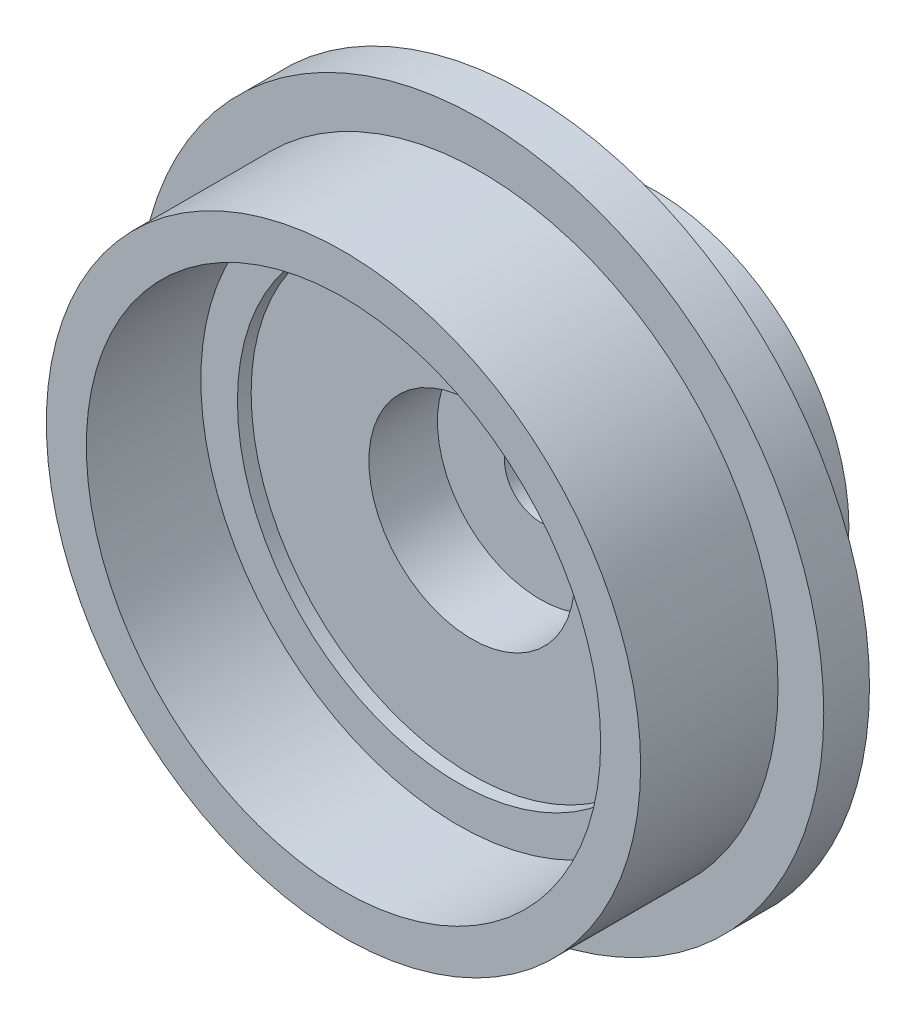
ISO-10303-21;
HEADER;
FILE_DESCRIPTION(('STEP AP214'),'2;1');
FILE_NAME('part.step','',(''),(''),'','','');
FILE_SCHEMA(('AUTOMOTIVE_DESIGN { 1 0 10303 214 1 1 1 1 }'));
ENDSEC;
DATA;
#1=APPLICATION_CONTEXT('core data for automotive mechanical design processes');
#2=APPLICATION_PROTOCOL_DEFINITION('international standard','automotive_design',2000,#1);
#3=PRODUCT_CONTEXT('',#1,'mechanical');
#4=PRODUCT('Part','Part','',(#3));
#5=PRODUCT_RELATED_PRODUCT_CATEGORY('part','',(#4));
#6=PRODUCT_DEFINITION_FORMATION('','',#4);
#7=PRODUCT_DEFINITION_CONTEXT('part definition',#1,'design');
#8=PRODUCT_DEFINITION('design','',#6,#7);
#9=PRODUCT_DEFINITION_SHAPE('','',#8);
#10=(LENGTH_UNIT() NAMED_UNIT(*) SI_UNIT(.MILLI.,.METRE.));
#11=(NAMED_UNIT(*) PLANE_ANGLE_UNIT() SI_UNIT($,.RADIAN.));
#12=(NAMED_UNIT(*) SI_UNIT($,.STERADIAN.) SOLID_ANGLE_UNIT());
#13=UNCERTAINTY_MEASURE_WITH_UNIT(LENGTH_MEASURE(1.E-05),#10,'distance_accuracy_value','');
#14=(GEOMETRIC_REPRESENTATION_CONTEXT(3) GLOBAL_UNCERTAINTY_ASSIGNED_CONTEXT((#13)) GLOBAL_UNIT_ASSIGNED_CONTEXT((#10,
#11,#12)) REPRESENTATION_CONTEXT('',''));
#15=CARTESIAN_POINT('',(0.,0.,0.));
#16=DIRECTION('',(0.,0.,1.));
#17=DIRECTION('',(1.,0.,0.));
#18=AXIS2_PLACEMENT_3D('',#15,#16,#17);
#19=CARTESIAN_POINT('',(0.,0.,-17.2847));
#20=DIRECTION('',(0.,0.,1.));
#21=DIRECTION('',(1.,0.,0.));
#22=AXIS2_PLACEMENT_3D('',#19,#20,#21);
#23=CYLINDRICAL_SURFACE('',#22,1.9939);
#24=CARTESIAN_POINT('',(0.,0.,-17.2847));
#25=DIRECTION('',(0.,0.,1.));
#26=DIRECTION('',(1.,0.,0.));
#27=AXIS2_PLACEMENT_3D('',#24,#25,#26);
#28=CIRCLE('',#27,1.9939);
#29=CARTESIAN_POINT('',(1.9939,0.,-17.2847));
#30=VERTEX_POINT('',#29);
#31=EDGE_CURVE('E73',#30,#30,#28,.T.);
#32=ORIENTED_EDGE('',*,*,#31,.F.);
#33=EDGE_LOOP('',(#32));
#34=FACE_BOUND('',#33,.T.);
#35=CARTESIAN_POINT('',(0.,0.,-10.9347));
#36=DIRECTION('',(0.,0.,1.));
#37=DIRECTION('',(1.,0.,0.));
#38=AXIS2_PLACEMENT_3D('',#35,#36,#37);
#39=CIRCLE('',#38,1.9939);
#40=CARTESIAN_POINT('',(1.9939,0.,-10.9347));
#41=VERTEX_POINT('',#40);
#42=EDGE_CURVE('E39',#41,#41,#39,.F.);
#43=ORIENTED_EDGE('',*,*,#42,.F.);
#44=EDGE_LOOP('',(#43));
#45=FACE_BOUND('',#44,.T.);
#46=ADVANCED_FACE('F35',(#34,#45),#23,.F.);
#47=CARTESIAN_POINT('',(0.,16.51,-7.6327));
#48=DIRECTION('',(0.,0.,-1.));
#49=DIRECTION('',(-1.,0.,0.));
#50=AXIS2_PLACEMENT_3D('',#47,#48,#49);
#51=PLANE('',#50);
#52=CARTESIAN_POINT('',(0.,0.,-7.6327));
#53=DIRECTION('',(0.,0.,1.));
#54=DIRECTION('',(1.,0.,0.));
#55=AXIS2_PLACEMENT_3D('',#52,#53,#54);
#56=CIRCLE('',#55,16.51);
#57=CARTESIAN_POINT('',(16.51,0.,-7.6327));
#58=VERTEX_POINT('',#57);
#59=EDGE_CURVE('E70',#58,#58,#56,.T.);
#60=ORIENTED_EDGE('',*,*,#59,.F.);
#61=EDGE_LOOP('',(#60));
#62=FACE_BOUND('',#61,.T.);
#63=CARTESIAN_POINT('',(0.,0.,-7.6327));
#64=DIRECTION('',(0.,0.,1.));
#65=DIRECTION('',(1.,0.,0.));
#66=AXIS2_PLACEMENT_3D('',#63,#64,#65);
#67=CIRCLE('',#66,19.05);
#68=CARTESIAN_POINT('',(19.05,0.,-7.6327));
#69=VERTEX_POINT('',#68);
#70=EDGE_CURVE('E10',#69,#69,#67,.T.);
#71=ORIENTED_EDGE('',*,*,#70,.T.);
#72=EDGE_LOOP('',(#71));
#73=FACE_BOUND('',#72,.T.);
#74=ADVANCED_FACE('F37',(#62,#73),#51,.F.);
#75=CARTESIAN_POINT('',(0.,0.,32.3517370738342));
#76=DIRECTION('',(0.,0.,1.));
#77=DIRECTION('',(1.,0.,0.));
#78=AXIS2_PLACEMENT_3D('',#75,#76,#77);
#79=CYLINDRICAL_SURFACE('',#78,19.05);
#80=ORIENTED_EDGE('',*,*,#70,.F.);
#81=EDGE_LOOP('',(#80));
#82=FACE_BOUND('',#81,.T.);
#83=CARTESIAN_POINT('',(0.,0.,-10.1727));
#84=DIRECTION('',(0.,0.,1.));
#85=DIRECTION('',(1.,0.,0.));
#86=AXIS2_PLACEMENT_3D('',#83,#84,#85);
#87=CIRCLE('',#86,19.05);
#88=CARTESIAN_POINT('',(19.05,0.,-10.1727));
#89=VERTEX_POINT('',#88);
#90=EDGE_CURVE('E43',#89,#89,#87,.T.);
#91=ORIENTED_EDGE('',*,*,#90,.T.);
#92=EDGE_LOOP('',(#91));
#93=FACE_BOUND('',#92,.T.);
#94=ADVANCED_FACE('F94',(#82,#93),#79,.T.);
#95=CARTESIAN_POINT('',(0.,19.05,-10.1727));
#96=DIRECTION('',(0.,0.,1.));
#97=DIRECTION('',(1.,0.,0.));
#98=AXIS2_PLACEMENT_3D('',#95,#96,#97);
#99=PLANE('',#98);
#100=ORIENTED_EDGE('',*,*,#90,.F.);
#101=EDGE_LOOP('',(#100));
#102=FACE_BOUND('',#101,.T.);
#103=CARTESIAN_POINT('',(0.,0.,-10.1727));
#104=DIRECTION('',(0.,0.,1.));
#105=DIRECTION('',(1.,0.,0.));
#106=AXIS2_PLACEMENT_3D('',#103,#104,#105);
#107=CIRCLE('',#106,10.795);
#108=CARTESIAN_POINT('',(10.795,0.,-10.1727));
#109=VERTEX_POINT('',#108);
#110=EDGE_CURVE('E47',#109,#109,#107,.T.);
#111=ORIENTED_EDGE('',*,*,#110,.T.);
#112=EDGE_LOOP('',(#111));
#113=FACE_BOUND('',#112,.T.);
#114=ADVANCED_FACE('F132',(#102,#113),#99,.F.);
#115=CARTESIAN_POINT('',(0.,0.,32.3517370738342));
#116=DIRECTION('',(0.,0.,1.));
#117=DIRECTION('',(1.,0.,0.));
#118=AXIS2_PLACEMENT_3D('',#115,#116,#117);
#119=CYLINDRICAL_SURFACE('',#118,10.795);
#120=ORIENTED_EDGE('',*,*,#110,.F.);
#121=EDGE_LOOP('',(#120));
#122=FACE_BOUND('',#121,.T.);
#123=CARTESIAN_POINT('',(0.,0.,-17.2847));
#124=DIRECTION('',(0.,0.,1.));
#125=DIRECTION('',(1.,0.,0.));
#126=AXIS2_PLACEMENT_3D('',#123,#124,#125);
#127=CIRCLE('',#126,10.795);
#128=CARTESIAN_POINT('',(10.795,0.,-17.2847));
#129=VERTEX_POINT('',#128);
#130=EDGE_CURVE('E52',#129,#129,#127,.T.);
#131=ORIENTED_EDGE('',*,*,#130,.T.);
#132=EDGE_LOOP('',(#131));
#133=FACE_BOUND('',#132,.T.);
#134=ADVANCED_FACE('F128',(#122,#133),#119,.T.);
#135=CARTESIAN_POINT('',(0.,10.795,-17.2847));
#136=DIRECTION('',(0.,0.,1.));
#137=DIRECTION('',(1.,0.,0.));
#138=AXIS2_PLACEMENT_3D('',#135,#136,#137);
#139=PLANE('',#138);
#140=ORIENTED_EDGE('',*,*,#31,.T.);
#141=EDGE_LOOP('',(#140));
#142=FACE_BOUND('',#141,.T.);
#143=ORIENTED_EDGE('',*,*,#130,.F.);
#144=EDGE_LOOP('',(#143));
#145=FACE_BOUND('',#144,.T.);
#146=ADVANCED_FACE('F124',(#142,#145),#139,.F.);
#147=CARTESIAN_POINT('',(0.,0.,-7.1247));
#148=DIRECTION('',(0.,0.,-1.));
#149=DIRECTION('',(-1.,0.,0.));
#150=AXIS2_PLACEMENT_3D('',#147,#148,#149);
#151=PLANE('',#150);
#152=CARTESIAN_POINT('',(0.,0.,-7.1247));
#153=DIRECTION('',(0.,0.,1.));
#154=DIRECTION('',(1.,0.,0.));
#155=AXIS2_PLACEMENT_3D('',#152,#153,#154);
#156=CIRCLE('',#155,5.715);
#157=CARTESIAN_POINT('',(5.715,0.,-7.1247));
#158=VERTEX_POINT('',#157);
#159=EDGE_CURVE('E76',#158,#158,#156,.T.);
#160=ORIENTED_EDGE('',*,*,#159,.F.);
#161=EDGE_LOOP('',(#160));
#162=FACE_BOUND('',#161,.T.);
#163=CARTESIAN_POINT('',(0.,0.,-7.1247));
#164=DIRECTION('',(0.,0.,1.));
#165=DIRECTION('',(1.,0.,0.));
#166=AXIS2_PLACEMENT_3D('',#163,#164,#165);
#167=CIRCLE('',#166,12.2555);
#168=CARTESIAN_POINT('',(12.2555,0.,-7.1247));
#169=VERTEX_POINT('',#168);
#170=EDGE_CURVE('E55',#169,#169,#167,.T.);
#171=ORIENTED_EDGE('',*,*,#170,.T.);
#172=EDGE_LOOP('',(#171));
#173=FACE_BOUND('',#172,.T.);
#174=ADVANCED_FACE('F120',(#162,#173),#151,.F.);
#175=CARTESIAN_POINT('',(0.,0.,32.3517370738342));
#176=DIRECTION('',(0.,0.,1.));
#177=DIRECTION('',(1.,0.,0.));
#178=AXIS2_PLACEMENT_3D('',#175,#176,#177);
#179=CYLINDRICAL_SURFACE('',#178,12.2555);
#180=ORIENTED_EDGE('',*,*,#170,.F.);
#181=EDGE_LOOP('',(#180));
#182=FACE_BOUND('',#181,.T.);
#183=CARTESIAN_POINT('',(0.,0.,-6.3627));
#184=DIRECTION('',(0.,0.,1.));
#185=DIRECTION('',(1.,0.,0.));
#186=AXIS2_PLACEMENT_3D('',#183,#184,#185);
#187=CIRCLE('',#186,12.2555);
#188=CARTESIAN_POINT('',(12.2555,0.,-6.3627));
#189=VERTEX_POINT('',#188);
#190=EDGE_CURVE('E58',#189,#189,#187,.T.);
#191=ORIENTED_EDGE('',*,*,#190,.T.);
#192=EDGE_LOOP('',(#191));
#193=FACE_BOUND('',#192,.T.);
#194=ADVANCED_FACE('F116',(#182,#193),#179,.F.);
#195=CARTESIAN_POINT('',(0.,12.2555,-6.3627));
#196=DIRECTION('',(0.,0.,-1.));
#197=DIRECTION('',(-1.,0.,0.));
#198=AXIS2_PLACEMENT_3D('',#195,#196,#197);
#199=PLANE('',#198);
#200=ORIENTED_EDGE('',*,*,#190,.F.);
#201=EDGE_LOOP('',(#200));
#202=FACE_BOUND('',#201,.T.);
#203=CARTESIAN_POINT('',(0.,0.,-6.3627));
#204=DIRECTION('',(0.,0.,1.));
#205=DIRECTION('',(1.,0.,0.));
#206=AXIS2_PLACEMENT_3D('',#203,#204,#205);
#207=CIRCLE('',#206,14.2875);
#208=CARTESIAN_POINT('',(14.2875,0.,-6.3627));
#209=VERTEX_POINT('',#208);
#210=EDGE_CURVE('E61',#209,#209,#207,.T.);
#211=ORIENTED_EDGE('',*,*,#210,.T.);
#212=EDGE_LOOP('',(#211));
#213=FACE_BOUND('',#212,.T.);
#214=ADVANCED_FACE('F112',(#202,#213),#199,.F.);
#215=CARTESIAN_POINT('',(0.,0.,32.3517370738342));
#216=DIRECTION('',(0.,0.,1.));
#217=DIRECTION('',(1.,0.,0.));
#218=AXIS2_PLACEMENT_3D('',#215,#216,#217);
#219=CYLINDRICAL_SURFACE('',#218,14.2875);
#220=ORIENTED_EDGE('',*,*,#210,.F.);
#221=EDGE_LOOP('',(#220));
#222=FACE_BOUND('',#221,.T.);
#223=CARTESIAN_POINT('',(0.,0.,0.));
#224=DIRECTION('',(0.,0.,1.));
#225=DIRECTION('',(1.,0.,0.));
#226=AXIS2_PLACEMENT_3D('',#223,#224,#225);
#227=CIRCLE('',#226,14.2875);
#228=CARTESIAN_POINT('',(14.2875,0.,0.));
#229=VERTEX_POINT('',#228);
#230=EDGE_CURVE('E64',#229,#229,#227,.T.);
#231=ORIENTED_EDGE('',*,*,#230,.T.);
#232=EDGE_LOOP('',(#231));
#233=FACE_BOUND('',#232,.T.);
#234=ADVANCED_FACE('F108',(#222,#233),#219,.F.);
#235=CARTESIAN_POINT('',(0.,14.2875,0.));
#236=DIRECTION('',(0.,0.,-1.));
#237=DIRECTION('',(-1.,0.,0.));
#238=AXIS2_PLACEMENT_3D('',#235,#236,#237);
#239=PLANE('',#238);
#240=ORIENTED_EDGE('',*,*,#230,.F.);
#241=EDGE_LOOP('',(#240));
#242=FACE_BOUND('',#241,.T.);
#243=CARTESIAN_POINT('',(0.,0.,0.));
#244=DIRECTION('',(0.,0.,1.));
#245=DIRECTION('',(1.,0.,0.));
#246=AXIS2_PLACEMENT_3D('',#243,#244,#245);
#247=CIRCLE('',#246,16.51);
#248=CARTESIAN_POINT('',(16.51,0.,0.));
#249=VERTEX_POINT('',#248);
#250=EDGE_CURVE('E67',#249,#249,#247,.T.);
#251=ORIENTED_EDGE('',*,*,#250,.T.);
#252=EDGE_LOOP('',(#251));
#253=FACE_BOUND('',#252,.T.);
#254=ADVANCED_FACE('F104',(#242,#253),#239,.F.);
#255=CARTESIAN_POINT('',(0.,0.,32.3517370738342));
#256=DIRECTION('',(0.,0.,1.));
#257=DIRECTION('',(1.,0.,0.));
#258=AXIS2_PLACEMENT_3D('',#255,#256,#257);
#259=CYLINDRICAL_SURFACE('',#258,16.51);
#260=ORIENTED_EDGE('',*,*,#250,.F.);
#261=EDGE_LOOP('',(#260));
#262=FACE_BOUND('',#261,.T.);
#263=ORIENTED_EDGE('',*,*,#59,.T.);
#264=EDGE_LOOP('',(#263));
#265=FACE_BOUND('',#264,.T.);
#266=ADVANCED_FACE('F101',(#262,#265),#259,.T.);
#267=CARTESIAN_POINT('',(0.,0.,-10.9347));
#268=DIRECTION('',(0.,0.,1.));
#269=DIRECTION('',(1.,0.,0.));
#270=AXIS2_PLACEMENT_3D('',#267,#268,#269);
#271=PLANE('',#270);
#272=CARTESIAN_POINT('',(0.,0.,-10.9347));
#273=DIRECTION('',(0.,0.,1.));
#274=DIRECTION('',(1.,0.,0.));
#275=AXIS2_PLACEMENT_3D('',#272,#273,#274);
#276=CIRCLE('',#275,5.715);
#277=CARTESIAN_POINT('',(5.715,0.,-10.9347));
#278=VERTEX_POINT('',#277);
#279=EDGE_CURVE('E79',#278,#278,#276,.T.);
#280=ORIENTED_EDGE('',*,*,#279,.T.);
#281=EDGE_LOOP('',(#280));
#282=FACE_BOUND('',#281,.T.);
#283=ORIENTED_EDGE('',*,*,#42,.T.);
#284=EDGE_LOOP('',(#283));
#285=FACE_BOUND('',#284,.T.);
#286=ADVANCED_FACE('F86',(#282,#285),#271,.T.);
#287=CARTESIAN_POINT('',(0.,0.,-10.9347));
#288=DIRECTION('',(0.,0.,1.));
#289=DIRECTION('',(1.,0.,0.));
#290=AXIS2_PLACEMENT_3D('',#287,#288,#289);
#291=CYLINDRICAL_SURFACE('',#290,5.715);
#292=CARTESIAN_POINT('',(5.715,0.,-10.9347));
#293=CARTESIAN_POINT('',(5.715,0.,-10.8950125));
#294=CARTESIAN_POINT('',(5.715,0.,-10.855325));
#295=CARTESIAN_POINT('',(5.715,0.,-10.77595));
#296=CARTESIAN_POINT('',(5.715,0.,-10.7362625));
#297=CARTESIAN_POINT('',(5.715,0.,-10.6568875));
#298=CARTESIAN_POINT('',(5.715,0.,-10.6172));
#299=CARTESIAN_POINT('',(5.715,0.,-10.537825));
#300=CARTESIAN_POINT('',(5.715,0.,-10.4981375));
#301=CARTESIAN_POINT('',(5.715,0.,-10.4187625));
#302=CARTESIAN_POINT('',(5.715,0.,-10.379075));
#303=CARTESIAN_POINT('',(5.715,0.,-10.2997));
#304=CARTESIAN_POINT('',(5.715,0.,-10.2600125));
#305=CARTESIAN_POINT('',(5.715,0.,-10.1806375));
#306=CARTESIAN_POINT('',(5.715,0.,-10.14095));
#307=CARTESIAN_POINT('',(5.715,0.,-10.061575));
#308=CARTESIAN_POINT('',(5.715,0.,-10.0218875));
#309=CARTESIAN_POINT('',(5.715,0.,-9.9425125));
#310=CARTESIAN_POINT('',(5.715,0.,-9.902825));
#311=CARTESIAN_POINT('',(5.715,0.,-9.82345));
#312=CARTESIAN_POINT('',(5.715,0.,-9.7837625));
#313=CARTESIAN_POINT('',(5.715,0.,-9.7043875));
#314=CARTESIAN_POINT('',(5.715,0.,-9.6647));
#315=CARTESIAN_POINT('',(5.715,0.,-9.585325));
#316=CARTESIAN_POINT('',(5.715,0.,-9.5456375));
#317=CARTESIAN_POINT('',(5.715,0.,-9.4662625));
#318=CARTESIAN_POINT('',(5.715,0.,-9.426575));
#319=CARTESIAN_POINT('',(5.715,0.,-9.3472));
#320=CARTESIAN_POINT('',(5.715,0.,-9.3075125));
#321=CARTESIAN_POINT('',(5.715,0.,-9.2281375));
#322=CARTESIAN_POINT('',(5.715,0.,-9.18845));
#323=CARTESIAN_POINT('',(5.715,0.,-9.109075));
#324=CARTESIAN_POINT('',(5.715,0.,-9.0693875));
#325=CARTESIAN_POINT('',(5.715,0.,-8.9900125));
#326=CARTESIAN_POINT('',(5.715,0.,-8.950325));
#327=CARTESIAN_POINT('',(5.715,0.,-8.87095));
#328=CARTESIAN_POINT('',(5.715,0.,-8.8312625));
#329=CARTESIAN_POINT('',(5.715,0.,-8.7518875));
#330=CARTESIAN_POINT('',(5.715,0.,-8.7122));
#331=CARTESIAN_POINT('',(5.715,0.,-8.632825));
#332=CARTESIAN_POINT('',(5.715,0.,-8.5931375));
#333=CARTESIAN_POINT('',(5.715,0.,-8.5137625));
#334=CARTESIAN_POINT('',(5.715,0.,-8.474075));
#335=CARTESIAN_POINT('',(5.715,0.,-8.3947));
#336=CARTESIAN_POINT('',(5.715,0.,-8.3550125));
#337=CARTESIAN_POINT('',(5.715,0.,-8.2756375));
#338=CARTESIAN_POINT('',(5.715,0.,-8.23595));
#339=CARTESIAN_POINT('',(5.715,0.,-8.156575));
#340=CARTESIAN_POINT('',(5.715,0.,-8.1168875));
#341=CARTESIAN_POINT('',(5.715,0.,-8.0375125));
#342=CARTESIAN_POINT('',(5.715,0.,-7.997825));
#343=CARTESIAN_POINT('',(5.715,0.,-7.91845));
#344=CARTESIAN_POINT('',(5.715,0.,-7.8787625));
#345=CARTESIAN_POINT('',(5.715,0.,-7.7993875));
#346=CARTESIAN_POINT('',(5.715,0.,-7.7597));
#347=CARTESIAN_POINT('',(5.715,0.,-7.680325));
#348=CARTESIAN_POINT('',(5.715,0.,-7.6406375));
#349=CARTESIAN_POINT('',(5.715,0.,-7.5612625));
#350=CARTESIAN_POINT('',(5.715,0.,-7.521575));
#351=CARTESIAN_POINT('',(5.715,0.,-7.4422));
#352=CARTESIAN_POINT('',(5.715,0.,-7.4025125));
#353=CARTESIAN_POINT('',(5.715,0.,-7.3231375));
#354=CARTESIAN_POINT('',(5.715,0.,-7.28345));
#355=CARTESIAN_POINT('',(5.715,0.,-7.204075));
#356=CARTESIAN_POINT('',(5.715,0.,-7.1643875));
#357=CARTESIAN_POINT('',(5.715,0.,-7.1247));
#358=B_SPLINE_CURVE_WITH_KNOTS('',3,(#292,#293,#294,#295,#296,#297,#298,#299,#300,#301,#302,
#303,#304,#305,#306,#307,#308,#309,#310,#311,#312,#313,#314,#315,#316,#317,#318,#319,#320,#321,
#322,#323,#324,#325,#326,#327,#328,#329,#330,#331,#332,#333,#334,#335,#336,#337,#338,#339,#340,
#341,#342,#343,#344,#345,#346,#347,#348,#349,#350,#351,#352,#353,#354,#355,#356,#357),
.UNSPECIFIED.,.F.,.F.,(4,2,2,2,2,2,2,2,2,2,2,2,2,2,2,2,2,2,2,2,2,2,2,2,2,2,2,2,2,2,2,2,4),(0.,
0.119062500000001,0.238125,0.357187500000002,0.476250000000001,0.5953125,0.714375000000001,
0.833437500000001,0.9525,1.0715625,1.190625,1.3096875,1.42875,1.5478125,1.666875,1.7859375,
1.905,2.0240625,2.143125,2.2621875,2.38125,2.5003125,2.619375,2.7384375,2.8575,2.9765625,
3.095625,3.2146875,3.33375,3.4528125,3.571875,3.6909375,3.81),.UNSPECIFIED.);
#359=EDGE_CURVE('BSEAM99',#278,#158,#358,.T.);
#360=ORIENTED_EDGE('',*,*,#279,.F.);
#361=ORIENTED_EDGE('',*,*,#159,.T.);
#362=ORIENTED_EDGE('',*,*,#359,.T.);
#363=ORIENTED_EDGE('',*,*,#359,.F.);
#364=EDGE_LOOP('',(#360,#362,#361,#363));
#365=FACE_BOUND('',#364,.T.);
#366=ADVANCED_FACE('F99',(#365),#291,.F.);
#367=CLOSED_SHELL('',(#46,#74,#94,#114,#134,#146,#174,#194,#214,#234,#254,#266,#286,#366));
#368=MANIFOLD_SOLID_BREP('B2',#367);
#369=ADVANCED_BREP_SHAPE_REPRESENTATION('',(#18,#368),#14);
#370=SHAPE_DEFINITION_REPRESENTATION(#9,#369);
ENDSEC;
END-ISO-10303-21;
